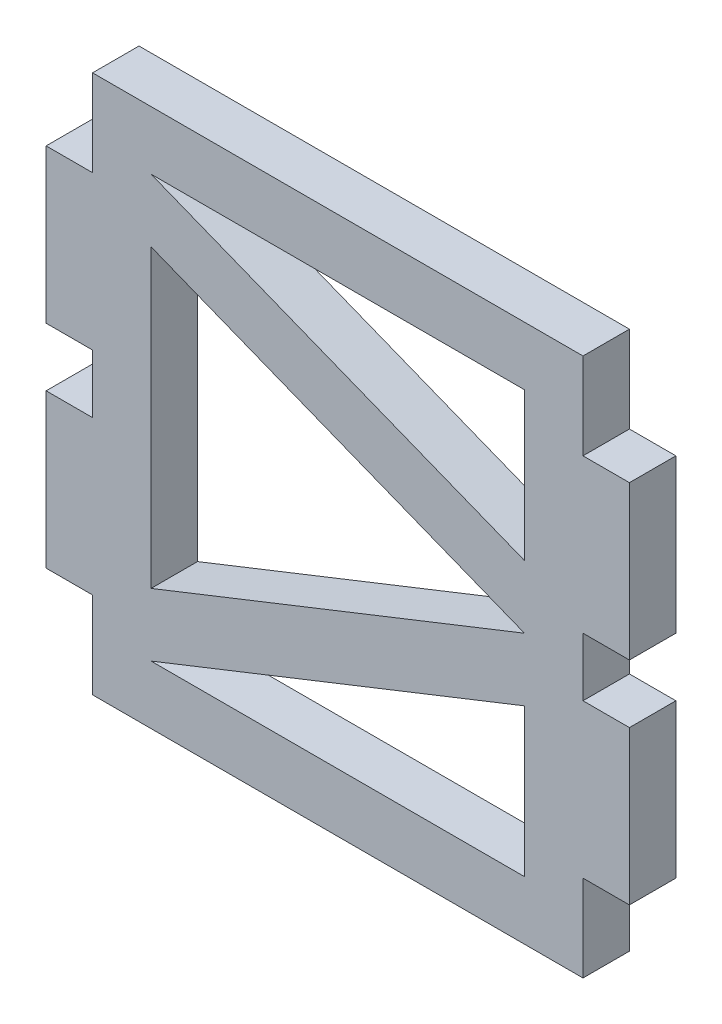
ISO-10303-21;
HEADER;
FILE_DESCRIPTION(('STEP AP214'),'2;1');
FILE_NAME('part.step','',(''),(''),'','','');
FILE_SCHEMA(('AUTOMOTIVE_DESIGN { 1 0 10303 214 1 1 1 1 }'));
ENDSEC;
DATA;
#1=APPLICATION_CONTEXT('core data for automotive mechanical design processes');
#2=APPLICATION_PROTOCOL_DEFINITION('international standard','automotive_design',2000,#1);
#3=PRODUCT_CONTEXT('',#1,'mechanical');
#4=PRODUCT('Part','Part','',(#3));
#5=PRODUCT_RELATED_PRODUCT_CATEGORY('part','',(#4));
#6=PRODUCT_DEFINITION_FORMATION('','',#4);
#7=PRODUCT_DEFINITION_CONTEXT('part definition',#1,'design');
#8=PRODUCT_DEFINITION('design','',#6,#7);
#9=PRODUCT_DEFINITION_SHAPE('','',#8);
#10=(LENGTH_UNIT() NAMED_UNIT(*) SI_UNIT(.MILLI.,.METRE.));
#11=(NAMED_UNIT(*) PLANE_ANGLE_UNIT() SI_UNIT($,.RADIAN.));
#12=(NAMED_UNIT(*) SI_UNIT($,.STERADIAN.) SOLID_ANGLE_UNIT());
#13=UNCERTAINTY_MEASURE_WITH_UNIT(LENGTH_MEASURE(1.E-05),#10,'distance_accuracy_value','');
#14=(GEOMETRIC_REPRESENTATION_CONTEXT(3) GLOBAL_UNCERTAINTY_ASSIGNED_CONTEXT((#13)) GLOBAL_UNIT_ASSIGNED_CONTEXT((#10,
#11,#12)) REPRESENTATION_CONTEXT('',''));
#15=CARTESIAN_POINT('',(0.,0.,0.));
#16=DIRECTION('',(0.,0.,1.));
#17=DIRECTION('',(1.,0.,0.));
#18=AXIS2_PLACEMENT_3D('',#15,#16,#17);
#19=CARTESIAN_POINT('',(7.175,50.1101546560199,57.452953627601));
#20=DIRECTION('',(1.,0.,0.));
#21=DIRECTION('',(0.,1.,0.));
#22=AXIS2_PLACEMENT_3D('',#19,#20,#21);
#23=PLANE('',#22);
#24=DIRECTION('',(0.,0.,-1.));
#25=VECTOR('',#24,1.);
#26=CARTESIAN_POINT('',(7.175,50.1101546560199,57.452953627601));
#27=LINE('',#26,#25);
#28=CARTESIAN_POINT('',(7.175,50.1101546560199,3.175));
#29=VERTEX_POINT('',#28);
#30=CARTESIAN_POINT('',(7.175,50.1101546560199,0.));
#31=VERTEX_POINT('',#30);
#32=EDGE_CURVE('E277',#29,#31,#27,.T.);
#33=ORIENTED_EDGE('',*,*,#32,.F.);
#34=DIRECTION('',(0.,-1.,0.));
#35=VECTOR('',#34,1.);
#36=CARTESIAN_POINT('',(7.175,50.1101546560199,3.175));
#37=LINE('',#36,#35);
#38=CARTESIAN_POINT('',(7.175,29.8898453439801,3.175));
#39=VERTEX_POINT('',#38);
#40=EDGE_CURVE('E515',#29,#39,#37,.T.);
#41=ORIENTED_EDGE('',*,*,#40,.T.);
#42=DIRECTION('',(0.,0.,-1.));
#43=VECTOR('',#42,1.);
#44=CARTESIAN_POINT('',(7.175,29.8898453439801,57.452953627601));
#45=LINE('',#44,#43);
#46=CARTESIAN_POINT('',(7.175,29.8898453439801,0.));
#47=VERTEX_POINT('',#46);
#48=EDGE_CURVE('E275',#39,#47,#45,.T.);
#49=ORIENTED_EDGE('',*,*,#48,.T.);
#50=DIRECTION('',(0.,-1.,0.));
#51=VECTOR('',#50,1.);
#52=CARTESIAN_POINT('',(7.175,50.1101546560199,0.));
#53=LINE('',#52,#51);
#54=EDGE_CURVE('E272',#31,#47,#53,.T.);
#55=ORIENTED_EDGE('',*,*,#54,.F.);
#56=EDGE_LOOP('',(#33,#41,#49,#55));
#57=FACE_BOUND('',#56,.T.);
#58=ADVANCED_FACE('F35',(#57),#23,.T.);
#59=CARTESIAN_POINT('',(32.7,40.,57.452953627601));
#60=DIRECTION('',(-0.368253405634251,-0.92972545906777,0.));
#61=DIRECTION('',(0.92972545906777,-0.368253405634251,0.));
#62=AXIS2_PLACEMENT_3D('',#59,#60,#61);
#63=PLANE('',#62);
#64=DIRECTION('',(0.,0.,-1.));
#65=VECTOR('',#64,1.);
#66=CARTESIAN_POINT('',(32.7,40.,57.452953627601));
#67=LINE('',#66,#65);
#68=CARTESIAN_POINT('',(32.7,40.,3.175));
#69=VERTEX_POINT('',#68);
#70=CARTESIAN_POINT('',(32.7,40.,0.));
#71=VERTEX_POINT('',#70);
#72=EDGE_CURVE('E279',#69,#71,#67,.T.);
#73=ORIENTED_EDGE('',*,*,#72,.F.);
#74=DIRECTION('',(-0.92972545906777,0.368253405634251,0.));
#75=VECTOR('',#74,1.);
#76=CARTESIAN_POINT('',(32.7,40.,3.175));
#77=LINE('',#76,#75);
#78=EDGE_CURVE('E518',#69,#29,#77,.T.);
#79=ORIENTED_EDGE('',*,*,#78,.T.);
#80=ORIENTED_EDGE('',*,*,#32,.T.);
#81=DIRECTION('',(-0.92972545906777,0.368253405634251,0.));
#82=VECTOR('',#81,1.);
#83=CARTESIAN_POINT('',(32.7,40.,0.));
#84=LINE('',#83,#82);
#85=EDGE_CURVE('E269',#71,#31,#84,.T.);
#86=ORIENTED_EDGE('',*,*,#85,.F.);
#87=EDGE_LOOP('',(#73,#79,#80,#86));
#88=FACE_BOUND('',#87,.T.);
#89=ADVANCED_FACE('F552',(#88),#63,.T.);
#90=CARTESIAN_POINT('',(7.175,29.8898453439801,57.452953627601));
#91=DIRECTION('',(-0.368253405634251,0.92972545906777,0.));
#92=DIRECTION('',(-0.92972545906777,-0.368253405634251,0.));
#93=AXIS2_PLACEMENT_3D('',#90,#91,#92);
#94=PLANE('',#93);
#95=ORIENTED_EDGE('',*,*,#48,.F.);
#96=DIRECTION('',(0.92972545906777,0.368253405634251,0.));
#97=VECTOR('',#96,1.);
#98=CARTESIAN_POINT('',(7.175,29.8898453439801,3.175));
#99=LINE('',#98,#97);
#100=EDGE_CURVE('E58',#39,#69,#99,.T.);
#101=ORIENTED_EDGE('',*,*,#100,.T.);
#102=ORIENTED_EDGE('',*,*,#72,.T.);
#103=DIRECTION('',(0.92972545906777,0.368253405634251,0.));
#104=VECTOR('',#103,1.);
#105=CARTESIAN_POINT('',(7.175,29.8898453439801,0.));
#106=LINE('',#105,#104);
#107=EDGE_CURVE('E266',#47,#71,#106,.T.);
#108=ORIENTED_EDGE('',*,*,#107,.F.);
#109=EDGE_LOOP('',(#95,#101,#102,#108));
#110=FACE_BOUND('',#109,.T.);
#111=ADVANCED_FACE('F544',(#110),#94,.T.);
#112=CARTESIAN_POINT('',(3.175,27.5,57.452953627601));
#113=DIRECTION('',(0.,1.,0.));
#114=DIRECTION('',(0.,0.,1.));
#115=AXIS2_PLACEMENT_3D('',#112,#113,#114);
#116=PLANE('',#115);
#117=DIRECTION('',(1.,0.,0.));
#118=VECTOR('',#117,1.);
#119=CARTESIAN_POINT('',(3.175,27.5,3.175));
#120=LINE('',#119,#118);
#121=CARTESIAN_POINT('',(0.,27.5,3.175));
#122=VERTEX_POINT('',#121);
#123=CARTESIAN_POINT('',(3.175,27.5,3.175));
#124=VERTEX_POINT('',#123);
#125=EDGE_CURVE('E522',#122,#124,#120,.T.);
#126=ORIENTED_EDGE('',*,*,#125,.F.);
#127=DIRECTION('',(0.,0.,-1.));
#128=VECTOR('',#127,1.);
#129=CARTESIAN_POINT('',(0.,27.5,57.452953627601));
#130=LINE('',#129,#128);
#131=CARTESIAN_POINT('',(0.,27.5,0.));
#132=VERTEX_POINT('',#131);
#133=EDGE_CURVE('E50',#122,#132,#130,.T.);
#134=ORIENTED_EDGE('',*,*,#133,.T.);
#135=DIRECTION('',(1.,0.,0.));
#136=VECTOR('',#135,1.);
#137=CARTESIAN_POINT('',(3.175,27.5,0.));
#138=LINE('',#137,#136);
#139=CARTESIAN_POINT('',(3.175,27.5,0.));
#140=VERTEX_POINT('',#139);
#141=EDGE_CURVE('E337',#132,#140,#138,.T.);
#142=ORIENTED_EDGE('',*,*,#141,.T.);
#143=DIRECTION('',(0.,0.,-1.));
#144=VECTOR('',#143,1.);
#145=CARTESIAN_POINT('',(3.175,27.5,57.452953627601));
#146=LINE('',#145,#144);
#147=EDGE_CURVE('E340',#124,#140,#146,.T.);
#148=ORIENTED_EDGE('',*,*,#147,.F.);
#149=EDGE_LOOP('',(#126,#134,#142,#148));
#150=FACE_BOUND('',#149,.T.);
#151=ADVANCED_FACE('F396',(#150),#116,.F.);
#152=CARTESIAN_POINT('',(0.,27.5,57.452953627601));
#153=DIRECTION('',(1.,0.,0.));
#154=DIRECTION('',(0.,0.,-1.));
#155=AXIS2_PLACEMENT_3D('',#152,#153,#154);
#156=PLANE('',#155);
#157=DIRECTION('',(0.,-1.,0.));
#158=VECTOR('',#157,1.);
#159=CARTESIAN_POINT('',(0.,27.5,3.175));
#160=LINE('',#159,#158);
#161=CARTESIAN_POINT('',(0.,38.,3.175));
#162=VERTEX_POINT('',#161);
#163=EDGE_CURVE('E403',#162,#122,#160,.T.);
#164=ORIENTED_EDGE('',*,*,#163,.F.);
#165=DIRECTION('',(0.,0.,-1.));
#166=VECTOR('',#165,1.);
#167=CARTESIAN_POINT('',(0.,38.,57.452953627601));
#168=LINE('',#167,#166);
#169=CARTESIAN_POINT('',(0.,38.,0.));
#170=VERTEX_POINT('',#169);
#171=EDGE_CURVE('E343',#162,#170,#168,.T.);
#172=ORIENTED_EDGE('',*,*,#171,.T.);
#173=DIRECTION('',(0.,-1.,0.));
#174=VECTOR('',#173,1.);
#175=CARTESIAN_POINT('',(0.,27.5,0.));
#176=LINE('',#175,#174);
#177=EDGE_CURVE('E335',#170,#132,#176,.T.);
#178=ORIENTED_EDGE('',*,*,#177,.T.);
#179=ORIENTED_EDGE('',*,*,#133,.F.);
#180=EDGE_LOOP('',(#164,#172,#178,#179));
#181=FACE_BOUND('',#180,.T.);
#182=ADVANCED_FACE('F400',(#181),#156,.F.);
#183=CARTESIAN_POINT('',(3.175,38.,57.452953627601));
#184=DIRECTION('',(0.,-1.,0.));
#185=DIRECTION('',(0.,0.,-1.));
#186=AXIS2_PLACEMENT_3D('',#183,#184,#185);
#187=PLANE('',#186);
#188=DIRECTION('',(-1.,0.,0.));
#189=VECTOR('',#188,1.);
#190=CARTESIAN_POINT('',(3.175,38.,3.175));
#191=LINE('',#190,#189);
#192=CARTESIAN_POINT('',(3.175,38.,3.175));
#193=VERTEX_POINT('',#192);
#194=EDGE_CURVE('E408',#193,#162,#191,.T.);
#195=ORIENTED_EDGE('',*,*,#194,.F.);
#196=DIRECTION('',(0.,0.,-1.));
#197=VECTOR('',#196,1.);
#198=CARTESIAN_POINT('',(3.175,38.,57.452953627601));
#199=LINE('',#198,#197);
#200=CARTESIAN_POINT('',(3.175,38.,0.));
#201=VERTEX_POINT('',#200);
#202=EDGE_CURVE('E345',#193,#201,#199,.T.);
#203=ORIENTED_EDGE('',*,*,#202,.T.);
#204=DIRECTION('',(-1.,0.,0.));
#205=VECTOR('',#204,1.);
#206=CARTESIAN_POINT('',(3.175,38.,0.));
#207=LINE('',#206,#205);
#208=EDGE_CURVE('E332',#201,#170,#207,.T.);
#209=ORIENTED_EDGE('',*,*,#208,.T.);
#210=ORIENTED_EDGE('',*,*,#171,.F.);
#211=EDGE_LOOP('',(#195,#203,#209,#210));
#212=FACE_BOUND('',#211,.T.);
#213=ADVANCED_FACE('F406',(#212),#187,.F.);
#214=CARTESIAN_POINT('',(3.175,42.,57.452953627601));
#215=DIRECTION('',(1.,0.,0.));
#216=DIRECTION('',(0.,0.,-1.));
#217=AXIS2_PLACEMENT_3D('',#214,#215,#216);
#218=PLANE('',#217);
#219=DIRECTION('',(0.,-1.,0.));
#220=VECTOR('',#219,1.);
#221=CARTESIAN_POINT('',(3.175,42.,3.175));
#222=LINE('',#221,#220);
#223=CARTESIAN_POINT('',(3.175,42.,3.175));
#224=VERTEX_POINT('',#223);
#225=EDGE_CURVE('E526',#224,#193,#222,.T.);
#226=ORIENTED_EDGE('',*,*,#225,.F.);
#227=DIRECTION('',(0.,0.,-1.));
#228=VECTOR('',#227,1.);
#229=CARTESIAN_POINT('',(3.175,42.,57.452953627601));
#230=LINE('',#229,#228);
#231=CARTESIAN_POINT('',(3.175,42.,0.));
#232=VERTEX_POINT('',#231);
#233=EDGE_CURVE('E347',#224,#232,#230,.T.);
#234=ORIENTED_EDGE('',*,*,#233,.T.);
#235=DIRECTION('',(0.,-1.,0.));
#236=VECTOR('',#235,1.);
#237=CARTESIAN_POINT('',(3.175,42.,0.));
#238=LINE('',#237,#236);
#239=EDGE_CURVE('E329',#232,#201,#238,.T.);
#240=ORIENTED_EDGE('',*,*,#239,.T.);
#241=ORIENTED_EDGE('',*,*,#202,.F.);
#242=EDGE_LOOP('',(#226,#234,#240,#241));
#243=FACE_BOUND('',#242,.T.);
#244=ADVANCED_FACE('F411',(#243),#218,.F.);
#245=CARTESIAN_POINT('',(3.175,42.,57.452953627601));
#246=DIRECTION('',(0.,1.,0.));
#247=DIRECTION('',(0.,0.,1.));
#248=AXIS2_PLACEMENT_3D('',#245,#246,#247);
#249=PLANE('',#248);
#250=DIRECTION('',(1.,0.,0.));
#251=VECTOR('',#250,1.);
#252=CARTESIAN_POINT('',(3.175,42.,3.175));
#253=LINE('',#252,#251);
#254=CARTESIAN_POINT('',(0.,42.,3.175));
#255=VERTEX_POINT('',#254);
#256=EDGE_CURVE('E420',#255,#224,#253,.T.);
#257=ORIENTED_EDGE('',*,*,#256,.F.);
#258=DIRECTION('',(0.,0.,-1.));
#259=VECTOR('',#258,1.);
#260=CARTESIAN_POINT('',(0.,42.,57.452953627601));
#261=LINE('',#260,#259);
#262=CARTESIAN_POINT('',(0.,42.,0.));
#263=VERTEX_POINT('',#262);
#264=EDGE_CURVE('E349',#255,#263,#261,.T.);
#265=ORIENTED_EDGE('',*,*,#264,.T.);
#266=DIRECTION('',(1.,0.,0.));
#267=VECTOR('',#266,1.);
#268=CARTESIAN_POINT('',(3.175,42.,0.));
#269=LINE('',#268,#267);
#270=EDGE_CURVE('E326',#263,#232,#269,.T.);
#271=ORIENTED_EDGE('',*,*,#270,.T.);
#272=ORIENTED_EDGE('',*,*,#233,.F.);
#273=EDGE_LOOP('',(#257,#265,#271,#272));
#274=FACE_BOUND('',#273,.T.);
#275=ADVANCED_FACE('F417',(#274),#249,.F.);
#276=CARTESIAN_POINT('',(0.,42.,57.452953627601));
#277=DIRECTION('',(1.,0.,0.));
#278=DIRECTION('',(0.,0.,-1.));
#279=AXIS2_PLACEMENT_3D('',#276,#277,#278);
#280=PLANE('',#279);
#281=DIRECTION('',(0.,-1.,0.));
#282=VECTOR('',#281,1.);
#283=CARTESIAN_POINT('',(0.,42.,3.175));
#284=LINE('',#283,#282);
#285=CARTESIAN_POINT('',(0.,52.5000000000001,3.175));
#286=VERTEX_POINT('',#285);
#287=EDGE_CURVE('E425',#286,#255,#284,.T.);
#288=ORIENTED_EDGE('',*,*,#287,.F.);
#289=DIRECTION('',(0.,0.,-1.));
#290=VECTOR('',#289,1.);
#291=CARTESIAN_POINT('',(0.,52.5000000000001,57.452953627601));
#292=LINE('',#291,#290);
#293=CARTESIAN_POINT('',(0.,52.5000000000001,0.));
#294=VERTEX_POINT('',#293);
#295=EDGE_CURVE('E351',#286,#294,#292,.T.);
#296=ORIENTED_EDGE('',*,*,#295,.T.);
#297=DIRECTION('',(0.,-1.,0.));
#298=VECTOR('',#297,1.);
#299=CARTESIAN_POINT('',(0.,42.,0.));
#300=LINE('',#299,#298);
#301=EDGE_CURVE('E323',#294,#263,#300,.T.);
#302=ORIENTED_EDGE('',*,*,#301,.T.);
#303=ORIENTED_EDGE('',*,*,#264,.F.);
#304=EDGE_LOOP('',(#288,#296,#302,#303));
#305=FACE_BOUND('',#304,.T.);
#306=ADVANCED_FACE('F423',(#305),#280,.F.);
#307=CARTESIAN_POINT('',(3.175,52.5000000000001,57.452953627601));
#308=DIRECTION('',(0.,-1.,0.));
#309=DIRECTION('',(0.,0.,-1.));
#310=AXIS2_PLACEMENT_3D('',#307,#308,#309);
#311=PLANE('',#310);
#312=DIRECTION('',(-1.,0.,0.));
#313=VECTOR('',#312,1.);
#314=CARTESIAN_POINT('',(3.175,52.5000000000001,3.175));
#315=LINE('',#314,#313);
#316=CARTESIAN_POINT('',(3.175,52.5000000000001,3.175));
#317=VERTEX_POINT('',#316);
#318=EDGE_CURVE('E530',#317,#286,#315,.T.);
#319=ORIENTED_EDGE('',*,*,#318,.F.);
#320=DIRECTION('',(0.,0.,-1.));
#321=VECTOR('',#320,1.);
#322=CARTESIAN_POINT('',(3.175,52.5000000000001,57.452953627601));
#323=LINE('',#322,#321);
#324=CARTESIAN_POINT('',(3.175,52.5000000000001,0.));
#325=VERTEX_POINT('',#324);
#326=EDGE_CURVE('E353',#317,#325,#323,.T.);
#327=ORIENTED_EDGE('',*,*,#326,.T.);
#328=DIRECTION('',(-1.,0.,0.));
#329=VECTOR('',#328,1.);
#330=CARTESIAN_POINT('',(3.175,52.5000000000001,0.));
#331=LINE('',#330,#329);
#332=EDGE_CURVE('E320',#325,#294,#331,.T.);
#333=ORIENTED_EDGE('',*,*,#332,.T.);
#334=ORIENTED_EDGE('',*,*,#295,.F.);
#335=EDGE_LOOP('',(#319,#327,#333,#334));
#336=FACE_BOUND('',#335,.T.);
#337=ADVANCED_FACE('F428',(#336),#311,.F.);
#338=CARTESIAN_POINT('',(3.175,58.4125,57.452953627601));
#339=DIRECTION('',(1.,0.,0.));
#340=DIRECTION('',(0.,0.,-1.));
#341=AXIS2_PLACEMENT_3D('',#338,#339,#340);
#342=PLANE('',#341);
#343=DIRECTION('',(0.,-1.,0.));
#344=VECTOR('',#343,1.);
#345=CARTESIAN_POINT('',(3.175,58.4125,3.175));
#346=LINE('',#345,#344);
#347=CARTESIAN_POINT('',(3.175,58.4125,3.175));
#348=VERTEX_POINT('',#347);
#349=EDGE_CURVE('E437',#348,#317,#346,.T.);
#350=ORIENTED_EDGE('',*,*,#349,.F.);
#351=DIRECTION('',(0.,0.,-1.));
#352=VECTOR('',#351,1.);
#353=CARTESIAN_POINT('',(3.175,58.4125,57.452953627601));
#354=LINE('',#353,#352);
#355=CARTESIAN_POINT('',(3.175,58.4125,0.));
#356=VERTEX_POINT('',#355);
#357=EDGE_CURVE('E355',#348,#356,#354,.T.);
#358=ORIENTED_EDGE('',*,*,#357,.T.);
#359=DIRECTION('',(0.,-1.,0.));
#360=VECTOR('',#359,1.);
#361=CARTESIAN_POINT('',(3.175,58.4125,0.));
#362=LINE('',#361,#360);
#363=EDGE_CURVE('E317',#356,#325,#362,.T.);
#364=ORIENTED_EDGE('',*,*,#363,.T.);
#365=ORIENTED_EDGE('',*,*,#326,.F.);
#366=EDGE_LOOP('',(#350,#358,#364,#365));
#367=FACE_BOUND('',#366,.T.);
#368=ADVANCED_FACE('F434',(#367),#342,.F.);
#369=CARTESIAN_POINT('',(36.7,58.4125,57.452953627601));
#370=DIRECTION('',(0.,-1.,0.));
#371=DIRECTION('',(0.,0.,-1.));
#372=AXIS2_PLACEMENT_3D('',#369,#370,#371);
#373=PLANE('',#372);
#374=DIRECTION('',(-1.,0.,0.));
#375=VECTOR('',#374,1.);
#376=CARTESIAN_POINT('',(36.7,58.4125,3.175));
#377=LINE('',#376,#375);
#378=CARTESIAN_POINT('',(36.7,58.4125,3.175));
#379=VERTEX_POINT('',#378);
#380=EDGE_CURVE('E442',#379,#348,#377,.T.);
#381=ORIENTED_EDGE('',*,*,#380,.F.);
#382=DIRECTION('',(0.,0.,-1.));
#383=VECTOR('',#382,1.);
#384=CARTESIAN_POINT('',(36.7,58.4125,57.452953627601));
#385=LINE('',#384,#383);
#386=CARTESIAN_POINT('',(36.7,58.4125,0.));
#387=VERTEX_POINT('',#386);
#388=EDGE_CURVE('E357',#379,#387,#385,.T.);
#389=ORIENTED_EDGE('',*,*,#388,.T.);
#390=DIRECTION('',(-1.,0.,0.));
#391=VECTOR('',#390,1.);
#392=CARTESIAN_POINT('',(36.7,58.4125,0.));
#393=LINE('',#392,#391);
#394=EDGE_CURVE('E314',#387,#356,#393,.T.);
#395=ORIENTED_EDGE('',*,*,#394,.T.);
#396=ORIENTED_EDGE('',*,*,#357,.F.);
#397=EDGE_LOOP('',(#381,#389,#395,#396));
#398=FACE_BOUND('',#397,.T.);
#399=ADVANCED_FACE('F440',(#398),#373,.F.);
#400=CARTESIAN_POINT('',(36.7,52.5,57.452953627601));
#401=DIRECTION('',(-1.,0.,0.));
#402=DIRECTION('',(0.,0.,1.));
#403=AXIS2_PLACEMENT_3D('',#400,#401,#402);
#404=PLANE('',#403);
#405=DIRECTION('',(0.,1.,0.));
#406=VECTOR('',#405,1.);
#407=CARTESIAN_POINT('',(36.7,52.5,3.175));
#408=LINE('',#407,#406);
#409=CARTESIAN_POINT('',(36.7,52.5,3.175));
#410=VERTEX_POINT('',#409);
#411=EDGE_CURVE('E534',#410,#379,#408,.T.);
#412=ORIENTED_EDGE('',*,*,#411,.F.);
#413=DIRECTION('',(0.,0.,-1.));
#414=VECTOR('',#413,1.);
#415=CARTESIAN_POINT('',(36.7,52.5,57.452953627601));
#416=LINE('',#415,#414);
#417=CARTESIAN_POINT('',(36.7,52.5,0.));
#418=VERTEX_POINT('',#417);
#419=EDGE_CURVE('E359',#410,#418,#416,.T.);
#420=ORIENTED_EDGE('',*,*,#419,.T.);
#421=DIRECTION('',(0.,1.,0.));
#422=VECTOR('',#421,1.);
#423=CARTESIAN_POINT('',(36.7,52.5,0.));
#424=LINE('',#423,#422);
#425=EDGE_CURVE('E311',#418,#387,#424,.T.);
#426=ORIENTED_EDGE('',*,*,#425,.T.);
#427=ORIENTED_EDGE('',*,*,#388,.F.);
#428=EDGE_LOOP('',(#412,#420,#426,#427));
#429=FACE_BOUND('',#428,.T.);
#430=ADVANCED_FACE('F445',(#429),#404,.F.);
#431=CARTESIAN_POINT('',(36.7,52.5,57.452953627601));
#432=DIRECTION('',(0.,-1.,0.));
#433=DIRECTION('',(1.,0.,0.));
#434=AXIS2_PLACEMENT_3D('',#431,#432,#433);
#435=PLANE('',#434);
#436=DIRECTION('',(-1.,0.,0.));
#437=VECTOR('',#436,1.);
#438=CARTESIAN_POINT('',(36.7,52.5,3.175));
#439=LINE('',#438,#437);
#440=CARTESIAN_POINT('',(39.875,52.5000000000001,3.175));
#441=VERTEX_POINT('',#440);
#442=EDGE_CURVE('E454',#441,#410,#439,.T.);
#443=ORIENTED_EDGE('',*,*,#442,.F.);
#444=DIRECTION('',(0.,0.,-1.));
#445=VECTOR('',#444,1.);
#446=CARTESIAN_POINT('',(39.875,52.5000000000001,57.452953627601));
#447=LINE('',#446,#445);
#448=CARTESIAN_POINT('',(39.875,52.5000000000001,0.));
#449=VERTEX_POINT('',#448);
#450=EDGE_CURVE('E361',#441,#449,#447,.T.);
#451=ORIENTED_EDGE('',*,*,#450,.T.);
#452=DIRECTION('',(-1.,0.,0.));
#453=VECTOR('',#452,1.);
#454=CARTESIAN_POINT('',(36.7,52.5,0.));
#455=LINE('',#454,#453);
#456=EDGE_CURVE('E308',#449,#418,#455,.T.);
#457=ORIENTED_EDGE('',*,*,#456,.T.);
#458=ORIENTED_EDGE('',*,*,#419,.F.);
#459=EDGE_LOOP('',(#443,#451,#457,#458));
#460=FACE_BOUND('',#459,.T.);
#461=ADVANCED_FACE('F451',(#460),#435,.F.);
#462=CARTESIAN_POINT('',(39.875,42.,57.452953627601));
#463=DIRECTION('',(-1.,0.,0.));
#464=DIRECTION('',(0.,-1.,0.));
#465=AXIS2_PLACEMENT_3D('',#462,#463,#464);
#466=PLANE('',#465);
#467=DIRECTION('',(0.,1.,0.));
#468=VECTOR('',#467,1.);
#469=CARTESIAN_POINT('',(39.875,42.,3.175));
#470=LINE('',#469,#468);
#471=CARTESIAN_POINT('',(39.875,42.,3.175));
#472=VERTEX_POINT('',#471);
#473=EDGE_CURVE('E459',#472,#441,#470,.T.);
#474=ORIENTED_EDGE('',*,*,#473,.F.);
#475=DIRECTION('',(0.,0.,-1.));
#476=VECTOR('',#475,1.);
#477=CARTESIAN_POINT('',(39.875,42.,57.452953627601));
#478=LINE('',#477,#476);
#479=CARTESIAN_POINT('',(39.875,42.,0.));
#480=VERTEX_POINT('',#479);
#481=EDGE_CURVE('E363',#472,#480,#478,.T.);
#482=ORIENTED_EDGE('',*,*,#481,.T.);
#483=DIRECTION('',(0.,1.,0.));
#484=VECTOR('',#483,1.);
#485=CARTESIAN_POINT('',(39.875,42.,0.));
#486=LINE('',#485,#484);
#487=EDGE_CURVE('E305',#480,#449,#486,.T.);
#488=ORIENTED_EDGE('',*,*,#487,.T.);
#489=ORIENTED_EDGE('',*,*,#450,.F.);
#490=EDGE_LOOP('',(#474,#482,#488,#489));
#491=FACE_BOUND('',#490,.T.);
#492=ADVANCED_FACE('F457',(#491),#466,.F.);
#493=CARTESIAN_POINT('',(36.7,42.,57.452953627601));
#494=DIRECTION('',(0.,1.,0.));
#495=DIRECTION('',(0.,0.,1.));
#496=AXIS2_PLACEMENT_3D('',#493,#494,#495);
#497=PLANE('',#496);
#498=DIRECTION('',(1.,0.,0.));
#499=VECTOR('',#498,1.);
#500=CARTESIAN_POINT('',(36.7,42.,3.175));
#501=LINE('',#500,#499);
#502=CARTESIAN_POINT('',(36.7,42.,3.175));
#503=VERTEX_POINT('',#502);
#504=EDGE_CURVE('E538',#503,#472,#501,.T.);
#505=ORIENTED_EDGE('',*,*,#504,.F.);
#506=DIRECTION('',(0.,0.,-1.));
#507=VECTOR('',#506,1.);
#508=CARTESIAN_POINT('',(36.7,42.,57.452953627601));
#509=LINE('',#508,#507);
#510=CARTESIAN_POINT('',(36.7,42.,0.));
#511=VERTEX_POINT('',#510);
#512=EDGE_CURVE('E365',#503,#511,#509,.T.);
#513=ORIENTED_EDGE('',*,*,#512,.T.);
#514=DIRECTION('',(1.,0.,0.));
#515=VECTOR('',#514,1.);
#516=CARTESIAN_POINT('',(36.7,42.,0.));
#517=LINE('',#516,#515);
#518=EDGE_CURVE('E302',#511,#480,#517,.T.);
#519=ORIENTED_EDGE('',*,*,#518,.T.);
#520=ORIENTED_EDGE('',*,*,#481,.F.);
#521=EDGE_LOOP('',(#505,#513,#519,#520));
#522=FACE_BOUND('',#521,.T.);
#523=ADVANCED_FACE('F462',(#522),#497,.F.);
#524=CARTESIAN_POINT('',(36.7,42.,57.452953627601));
#525=DIRECTION('',(-1.,0.,0.));
#526=DIRECTION('',(0.,-1.,0.));
#527=AXIS2_PLACEMENT_3D('',#524,#525,#526);
#528=PLANE('',#527);
#529=DIRECTION('',(0.,1.,0.));
#530=VECTOR('',#529,1.);
#531=CARTESIAN_POINT('',(36.7,42.,3.175));
#532=LINE('',#531,#530);
#533=CARTESIAN_POINT('',(36.7,38.,3.175));
#534=VERTEX_POINT('',#533);
#535=EDGE_CURVE('E471',#534,#503,#532,.T.);
#536=ORIENTED_EDGE('',*,*,#535,.F.);
#537=DIRECTION('',(0.,0.,-1.));
#538=VECTOR('',#537,1.);
#539=CARTESIAN_POINT('',(36.7,38.,57.452953627601));
#540=LINE('',#539,#538);
#541=CARTESIAN_POINT('',(36.7,38.,0.));
#542=VERTEX_POINT('',#541);
#543=EDGE_CURVE('E367',#534,#542,#540,.T.);
#544=ORIENTED_EDGE('',*,*,#543,.T.);
#545=DIRECTION('',(0.,1.,0.));
#546=VECTOR('',#545,1.);
#547=CARTESIAN_POINT('',(36.7,42.,0.));
#548=LINE('',#547,#546);
#549=EDGE_CURVE('E299',#542,#511,#548,.T.);
#550=ORIENTED_EDGE('',*,*,#549,.T.);
#551=ORIENTED_EDGE('',*,*,#512,.F.);
#552=EDGE_LOOP('',(#536,#544,#550,#551));
#553=FACE_BOUND('',#552,.T.);
#554=ADVANCED_FACE('F468',(#553),#528,.F.);
#555=CARTESIAN_POINT('',(36.7,38.,57.452953627601));
#556=DIRECTION('',(0.,-1.,0.));
#557=DIRECTION('',(1.,0.,0.));
#558=AXIS2_PLACEMENT_3D('',#555,#556,#557);
#559=PLANE('',#558);
#560=DIRECTION('',(-1.,0.,0.));
#561=VECTOR('',#560,1.);
#562=CARTESIAN_POINT('',(36.7,38.,3.175));
#563=LINE('',#562,#561);
#564=CARTESIAN_POINT('',(39.875,38.,3.175));
#565=VERTEX_POINT('',#564);
#566=EDGE_CURVE('E476',#565,#534,#563,.T.);
#567=ORIENTED_EDGE('',*,*,#566,.F.);
#568=DIRECTION('',(0.,0.,-1.));
#569=VECTOR('',#568,1.);
#570=CARTESIAN_POINT('',(39.875,38.,57.452953627601));
#571=LINE('',#570,#569);
#572=CARTESIAN_POINT('',(39.875,38.,0.));
#573=VERTEX_POINT('',#572);
#574=EDGE_CURVE('E369',#565,#573,#571,.T.);
#575=ORIENTED_EDGE('',*,*,#574,.T.);
#576=DIRECTION('',(-1.,0.,0.));
#577=VECTOR('',#576,1.);
#578=CARTESIAN_POINT('',(36.7,38.,0.));
#579=LINE('',#578,#577);
#580=EDGE_CURVE('E296',#573,#542,#579,.T.);
#581=ORIENTED_EDGE('',*,*,#580,.T.);
#582=ORIENTED_EDGE('',*,*,#543,.F.);
#583=EDGE_LOOP('',(#567,#575,#581,#582));
#584=FACE_BOUND('',#583,.T.);
#585=ADVANCED_FACE('F474',(#584),#559,.F.);
#586=CARTESIAN_POINT('',(39.875,27.5,57.452953627601));
#587=DIRECTION('',(-1.,0.,0.));
#588=DIRECTION('',(0.,-1.,0.));
#589=AXIS2_PLACEMENT_3D('',#586,#587,#588);
#590=PLANE('',#589);
#591=DIRECTION('',(0.,1.,0.));
#592=VECTOR('',#591,1.);
#593=CARTESIAN_POINT('',(39.875,27.5,3.175));
#594=LINE('',#593,#592);
#595=CARTESIAN_POINT('',(39.875,27.5,3.175));
#596=VERTEX_POINT('',#595);
#597=EDGE_CURVE('E542',#596,#565,#594,.T.);
#598=ORIENTED_EDGE('',*,*,#597,.F.);
#599=DIRECTION('',(0.,0.,-1.));
#600=VECTOR('',#599,1.);
#601=CARTESIAN_POINT('',(39.875,27.5,57.452953627601));
#602=LINE('',#601,#600);
#603=CARTESIAN_POINT('',(39.875,27.5,0.));
#604=VERTEX_POINT('',#603);
#605=EDGE_CURVE('E371',#596,#604,#602,.T.);
#606=ORIENTED_EDGE('',*,*,#605,.T.);
#607=DIRECTION('',(0.,1.,0.));
#608=VECTOR('',#607,1.);
#609=CARTESIAN_POINT('',(39.875,27.5,0.));
#610=LINE('',#609,#608);
#611=EDGE_CURVE('E293',#604,#573,#610,.T.);
#612=ORIENTED_EDGE('',*,*,#611,.T.);
#613=ORIENTED_EDGE('',*,*,#574,.F.);
#614=EDGE_LOOP('',(#598,#606,#612,#613));
#615=FACE_BOUND('',#614,.T.);
#616=ADVANCED_FACE('F479',(#615),#590,.F.);
#617=CARTESIAN_POINT('',(36.7,27.5,57.452953627601));
#618=DIRECTION('',(0.,1.,0.));
#619=DIRECTION('',(0.,0.,1.));
#620=AXIS2_PLACEMENT_3D('',#617,#618,#619);
#621=PLANE('',#620);
#622=DIRECTION('',(1.,0.,0.));
#623=VECTOR('',#622,1.);
#624=CARTESIAN_POINT('',(36.7,27.5,3.175));
#625=LINE('',#624,#623);
#626=CARTESIAN_POINT('',(36.7,27.5,3.175));
#627=VERTEX_POINT('',#626);
#628=EDGE_CURVE('E485',#627,#596,#625,.T.);
#629=ORIENTED_EDGE('',*,*,#628,.F.);
#630=DIRECTION('',(0.,0.,-1.));
#631=VECTOR('',#630,1.);
#632=CARTESIAN_POINT('',(36.7,27.5,57.452953627601));
#633=LINE('',#632,#631);
#634=CARTESIAN_POINT('',(36.7,27.5,0.));
#635=VERTEX_POINT('',#634);
#636=EDGE_CURVE('E373',#627,#635,#633,.T.);
#637=ORIENTED_EDGE('',*,*,#636,.T.);
#638=DIRECTION('',(1.,0.,0.));
#639=VECTOR('',#638,1.);
#640=CARTESIAN_POINT('',(36.7,27.5,0.));
#641=LINE('',#640,#639);
#642=EDGE_CURVE('E290',#635,#604,#641,.T.);
#643=ORIENTED_EDGE('',*,*,#642,.T.);
#644=ORIENTED_EDGE('',*,*,#605,.F.);
#645=EDGE_LOOP('',(#629,#637,#643,#644));
#646=FACE_BOUND('',#645,.T.);
#647=ADVANCED_FACE('F482',(#646),#621,.F.);
#648=CARTESIAN_POINT('',(36.7,27.5,57.452953627601));
#649=DIRECTION('',(-1.,0.,0.));
#650=DIRECTION('',(0.,0.,1.));
#651=AXIS2_PLACEMENT_3D('',#648,#649,#650);
#652=PLANE('',#651);
#653=DIRECTION('',(0.,1.,0.));
#654=VECTOR('',#653,1.);
#655=CARTESIAN_POINT('',(36.7,27.5,3.175));
#656=LINE('',#655,#654);
#657=CARTESIAN_POINT('',(36.7,21.5875,3.175));
#658=VERTEX_POINT('',#657);
#659=EDGE_CURVE('E489',#658,#627,#656,.T.);
#660=ORIENTED_EDGE('',*,*,#659,.F.);
#661=DIRECTION('',(0.,0.,-1.));
#662=VECTOR('',#661,1.);
#663=CARTESIAN_POINT('',(36.7,21.5875,57.452953627601));
#664=LINE('',#663,#662);
#665=CARTESIAN_POINT('',(36.7,21.5875,0.));
#666=VERTEX_POINT('',#665);
#667=EDGE_CURVE('E375',#658,#666,#664,.T.);
#668=ORIENTED_EDGE('',*,*,#667,.T.);
#669=DIRECTION('',(0.,1.,0.));
#670=VECTOR('',#669,1.);
#671=CARTESIAN_POINT('',(36.7,27.5,0.));
#672=LINE('',#671,#670);
#673=EDGE_CURVE('E287',#666,#635,#672,.T.);
#674=ORIENTED_EDGE('',*,*,#673,.T.);
#675=ORIENTED_EDGE('',*,*,#636,.F.);
#676=EDGE_LOOP('',(#660,#668,#674,#675));
#677=FACE_BOUND('',#676,.T.);
#678=ADVANCED_FACE('F488',(#677),#652,.F.);
#679=CARTESIAN_POINT('',(36.7,21.5875,57.452953627601));
#680=DIRECTION('',(0.,1.,0.));
#681=DIRECTION('',(0.,0.,1.));
#682=AXIS2_PLACEMENT_3D('',#679,#680,#681);
#683=PLANE('',#682);
#684=DIRECTION('',(1.,0.,0.));
#685=VECTOR('',#684,1.);
#686=CARTESIAN_POINT('',(36.7,21.5875,3.175));
#687=LINE('',#686,#685);
#688=CARTESIAN_POINT('',(3.175,21.5875,3.175));
#689=VERTEX_POINT('',#688);
#690=EDGE_CURVE('E383',#689,#658,#687,.T.);
#691=ORIENTED_EDGE('',*,*,#690,.F.);
#692=DIRECTION('',(0.,0.,-1.));
#693=VECTOR('',#692,1.);
#694=CARTESIAN_POINT('',(3.175,21.5875,57.452953627601));
#695=LINE('',#694,#693);
#696=CARTESIAN_POINT('',(3.175,21.5875,0.));
#697=VERTEX_POINT('',#696);
#698=EDGE_CURVE('E43',#689,#697,#695,.T.);
#699=ORIENTED_EDGE('',*,*,#698,.T.);
#700=DIRECTION('',(1.,0.,0.));
#701=VECTOR('',#700,1.);
#702=CARTESIAN_POINT('',(36.7,21.5875,0.));
#703=LINE('',#702,#701);
#704=EDGE_CURVE('E284',#697,#666,#703,.T.);
#705=ORIENTED_EDGE('',*,*,#704,.T.);
#706=ORIENTED_EDGE('',*,*,#667,.F.);
#707=EDGE_LOOP('',(#691,#699,#705,#706));
#708=FACE_BOUND('',#707,.T.);
#709=ADVANCED_FACE('F379',(#708),#683,.F.);
#710=CARTESIAN_POINT('',(3.175,21.5875,57.452953627601));
#711=DIRECTION('',(1.,0.,0.));
#712=DIRECTION('',(0.,0.,-1.));
#713=AXIS2_PLACEMENT_3D('',#710,#711,#712);
#714=PLANE('',#713);
#715=DIRECTION('',(0.,-1.,0.));
#716=VECTOR('',#715,1.);
#717=CARTESIAN_POINT('',(3.175,21.5875,3.175));
#718=LINE('',#717,#716);
#719=EDGE_CURVE('E393',#124,#689,#718,.T.);
#720=ORIENTED_EDGE('',*,*,#719,.F.);
#721=ORIENTED_EDGE('',*,*,#147,.T.);
#722=DIRECTION('',(0.,-1.,0.));
#723=VECTOR('',#722,1.);
#724=CARTESIAN_POINT('',(3.175,21.5875,0.));
#725=LINE('',#724,#723);
#726=EDGE_CURVE('E281',#140,#697,#725,.T.);
#727=ORIENTED_EDGE('',*,*,#726,.T.);
#728=ORIENTED_EDGE('',*,*,#698,.F.);
#729=EDGE_LOOP('',(#720,#721,#727,#728));
#730=FACE_BOUND('',#729,.T.);
#731=ADVANCED_FACE('F37',(#730),#714,.F.);
#732=CARTESIAN_POINT('',(7.175,54.4125,57.452953627601));
#733=DIRECTION('',(0.368253405634251,0.92972545906777,0.));
#734=DIRECTION('',(-0.92972545906777,0.368253405634251,0.));
#735=AXIS2_PLACEMENT_3D('',#732,#733,#734);
#736=PLANE('',#735);
#737=DIRECTION('',(0.,0.,-1.));
#738=VECTOR('',#737,1.);
#739=CARTESIAN_POINT('',(7.175,54.4125,57.452953627601));
#740=LINE('',#739,#738);
#741=CARTESIAN_POINT('',(7.175,54.4125,3.175));
#742=VERTEX_POINT('',#741);
#743=CARTESIAN_POINT('',(7.175,54.4125,0.));
#744=VERTEX_POINT('',#743);
#745=EDGE_CURVE('E262',#742,#744,#740,.T.);
#746=ORIENTED_EDGE('',*,*,#745,.F.);
#747=DIRECTION('',(0.92972545906777,-0.368253405634251,0.));
#748=VECTOR('',#747,1.);
#749=CARTESIAN_POINT('',(7.175,54.4125,3.175));
#750=LINE('',#749,#748);
#751=CARTESIAN_POINT('',(32.7,44.3023453439801,3.175));
#752=VERTEX_POINT('',#751);
#753=EDGE_CURVE('E504',#742,#752,#750,.T.);
#754=ORIENTED_EDGE('',*,*,#753,.T.);
#755=DIRECTION('',(0.,0.,-1.));
#756=VECTOR('',#755,1.);
#757=CARTESIAN_POINT('',(32.7,44.3023453439801,57.452953627601));
#758=LINE('',#757,#756);
#759=CARTESIAN_POINT('',(32.7,44.3023453439801,0.));
#760=VERTEX_POINT('',#759);
#761=EDGE_CURVE('E260',#752,#760,#758,.T.);
#762=ORIENTED_EDGE('',*,*,#761,.T.);
#763=DIRECTION('',(0.92972545906777,-0.368253405634251,0.));
#764=VECTOR('',#763,1.);
#765=CARTESIAN_POINT('',(7.175,54.4125,0.));
#766=LINE('',#765,#764);
#767=EDGE_CURVE('E257',#744,#760,#766,.T.);
#768=ORIENTED_EDGE('',*,*,#767,.F.);
#769=EDGE_LOOP('',(#746,#754,#762,#768));
#770=FACE_BOUND('',#769,.T.);
#771=ADVANCED_FACE('F618',(#770),#736,.T.);
#772=CARTESIAN_POINT('',(32.7,54.4125,57.452953627601));
#773=DIRECTION('',(0.,-1.,0.));
#774=DIRECTION('',(0.,0.,-1.));
#775=AXIS2_PLACEMENT_3D('',#772,#773,#774);
#776=PLANE('',#775);
#777=DIRECTION('',(0.,0.,-1.));
#778=VECTOR('',#777,1.);
#779=CARTESIAN_POINT('',(32.7,54.4125,57.452953627601));
#780=LINE('',#779,#778);
#781=CARTESIAN_POINT('',(32.7,54.4125,3.175));
#782=VERTEX_POINT('',#781);
#783=CARTESIAN_POINT('',(32.7,54.4125,0.));
#784=VERTEX_POINT('',#783);
#785=EDGE_CURVE('E264',#782,#784,#780,.T.);
#786=ORIENTED_EDGE('',*,*,#785,.F.);
#787=DIRECTION('',(-1.,0.,0.));
#788=VECTOR('',#787,1.);
#789=CARTESIAN_POINT('',(32.7,54.4125,3.175));
#790=LINE('',#789,#788);
#791=EDGE_CURVE('E507',#782,#742,#790,.T.);
#792=ORIENTED_EDGE('',*,*,#791,.T.);
#793=ORIENTED_EDGE('',*,*,#745,.T.);
#794=DIRECTION('',(-1.,0.,0.));
#795=VECTOR('',#794,1.);
#796=CARTESIAN_POINT('',(32.7,54.4125,0.));
#797=LINE('',#796,#795);
#798=EDGE_CURVE('E254',#784,#744,#797,.T.);
#799=ORIENTED_EDGE('',*,*,#798,.F.);
#800=EDGE_LOOP('',(#786,#792,#793,#799));
#801=FACE_BOUND('',#800,.T.);
#802=ADVANCED_FACE('F562',(#801),#776,.T.);
#803=CARTESIAN_POINT('',(32.7,44.3023453439801,57.452953627601));
#804=DIRECTION('',(-1.,0.,0.));
#805=DIRECTION('',(0.,0.,1.));
#806=AXIS2_PLACEMENT_3D('',#803,#804,#805);
#807=PLANE('',#806);
#808=ORIENTED_EDGE('',*,*,#761,.F.);
#809=DIRECTION('',(0.,1.,0.));
#810=VECTOR('',#809,1.);
#811=CARTESIAN_POINT('',(32.7,44.3023453439801,3.175));
#812=LINE('',#811,#810);
#813=EDGE_CURVE('E512',#752,#782,#812,.T.);
#814=ORIENTED_EDGE('',*,*,#813,.T.);
#815=ORIENTED_EDGE('',*,*,#785,.T.);
#816=DIRECTION('',(0.,1.,0.));
#817=VECTOR('',#816,1.);
#818=CARTESIAN_POINT('',(32.7,44.3023453439801,0.));
#819=LINE('',#818,#817);
#820=EDGE_CURVE('E247',#760,#784,#819,.T.);
#821=ORIENTED_EDGE('',*,*,#820,.F.);
#822=EDGE_LOOP('',(#808,#814,#815,#821));
#823=FACE_BOUND('',#822,.T.);
#824=ADVANCED_FACE('F554',(#823),#807,.T.);
#825=CARTESIAN_POINT('',(0.,0.,0.));
#826=DIRECTION('',(0.,0.,1.));
#827=DIRECTION('',(1.,0.,0.));
#828=AXIS2_PLACEMENT_3D('',#825,#826,#827);
#829=PLANE('',#828);
#830=ORIENTED_EDGE('',*,*,#820,.T.);
#831=ORIENTED_EDGE('',*,*,#798,.T.);
#832=ORIENTED_EDGE('',*,*,#767,.T.);
#833=EDGE_LOOP('',(#830,#831,#832));
#834=FACE_BOUND('',#833,.T.);
#835=ORIENTED_EDGE('',*,*,#726,.F.);
#836=ORIENTED_EDGE('',*,*,#141,.F.);
#837=ORIENTED_EDGE('',*,*,#177,.F.);
#838=ORIENTED_EDGE('',*,*,#208,.F.);
#839=ORIENTED_EDGE('',*,*,#239,.F.);
#840=ORIENTED_EDGE('',*,*,#270,.F.);
#841=ORIENTED_EDGE('',*,*,#301,.F.);
#842=ORIENTED_EDGE('',*,*,#332,.F.);
#843=ORIENTED_EDGE('',*,*,#363,.F.);
#844=ORIENTED_EDGE('',*,*,#394,.F.);
#845=ORIENTED_EDGE('',*,*,#425,.F.);
#846=ORIENTED_EDGE('',*,*,#456,.F.);
#847=ORIENTED_EDGE('',*,*,#487,.F.);
#848=ORIENTED_EDGE('',*,*,#518,.F.);
#849=ORIENTED_EDGE('',*,*,#549,.F.);
#850=ORIENTED_EDGE('',*,*,#580,.F.);
#851=ORIENTED_EDGE('',*,*,#611,.F.);
#852=ORIENTED_EDGE('',*,*,#642,.F.);
#853=ORIENTED_EDGE('',*,*,#673,.F.);
#854=ORIENTED_EDGE('',*,*,#704,.F.);
#855=EDGE_LOOP('',(#835,#836,#837,#838,#839,#840,#841,#842,#843,#844,#845,#846,#847,#848,#849,
#850,#851,#852,#853,#854));
#856=FACE_BOUND('',#855,.T.);
#857=ORIENTED_EDGE('',*,*,#107,.T.);
#858=ORIENTED_EDGE('',*,*,#85,.T.);
#859=ORIENTED_EDGE('',*,*,#54,.T.);
#860=EDGE_LOOP('',(#857,#858,#859));
#861=FACE_BOUND('',#860,.T.);
#862=DIRECTION('',(1.,0.,0.));
#863=VECTOR('',#862,1.);
#864=CARTESIAN_POINT('',(7.175,25.5875,0.));
#865=LINE('',#864,#863);
#866=CARTESIAN_POINT('',(7.175,25.5875,0.));
#867=VERTEX_POINT('',#866);
#868=CARTESIAN_POINT('',(32.7,25.5875,0.));
#869=VERTEX_POINT('',#868);
#870=EDGE_CURVE('E492',#867,#869,#865,.T.);
#871=ORIENTED_EDGE('',*,*,#870,.T.);
#872=DIRECTION('',(0.,1.,0.));
#873=VECTOR('',#872,1.);
#874=CARTESIAN_POINT('',(32.7,25.5875,0.));
#875=LINE('',#874,#873);
#876=CARTESIAN_POINT('',(32.7,35.6976546560199,0.));
#877=VERTEX_POINT('',#876);
#878=EDGE_CURVE('E499',#869,#877,#875,.T.);
#879=ORIENTED_EDGE('',*,*,#878,.T.);
#880=DIRECTION('',(-0.92972545906777,-0.368253405634252,0.));
#881=VECTOR('',#880,1.);
#882=CARTESIAN_POINT('',(32.7,35.6976546560199,0.));
#883=LINE('',#882,#881);
#884=EDGE_CURVE('E243',#877,#867,#883,.T.);
#885=ORIENTED_EDGE('',*,*,#884,.T.);
#886=EDGE_LOOP('',(#871,#879,#885));
#887=FACE_BOUND('',#886,.T.);
#888=ADVANCED_FACE('F389',(#834,#856,#861,#887),#829,.F.);
#889=CARTESIAN_POINT('',(32.7,35.6976546560199,57.452953627601));
#890=DIRECTION('',(0.368253405634252,-0.92972545906777,0.));
#891=DIRECTION('',(0.92972545906777,0.368253405634252,0.));
#892=AXIS2_PLACEMENT_3D('',#889,#890,#891);
#893=PLANE('',#892);
#894=DIRECTION('',(0.,0.,-1.));
#895=VECTOR('',#894,1.);
#896=CARTESIAN_POINT('',(32.7,35.6976546560199,57.452953627601));
#897=LINE('',#896,#895);
#898=CARTESIAN_POINT('',(32.7,35.6976546560199,3.175));
#899=VERTEX_POINT('',#898);
#900=EDGE_CURVE('E237',#899,#877,#897,.T.);
#901=ORIENTED_EDGE('',*,*,#900,.F.);
#902=DIRECTION('',(-0.92972545906777,-0.368253405634252,0.));
#903=VECTOR('',#902,1.);
#904=CARTESIAN_POINT('',(32.7,35.6976546560199,3.175));
#905=LINE('',#904,#903);
#906=CARTESIAN_POINT('',(7.175,25.5875,3.175));
#907=VERTEX_POINT('',#906);
#908=EDGE_CURVE('E11',#899,#907,#905,.T.);
#909=ORIENTED_EDGE('',*,*,#908,.T.);
#910=DIRECTION('',(0.,0.,-1.));
#911=VECTOR('',#910,1.);
#912=CARTESIAN_POINT('',(7.175,25.5875,57.452953627601));
#913=LINE('',#912,#911);
#914=EDGE_CURVE('E245',#907,#867,#913,.T.);
#915=ORIENTED_EDGE('',*,*,#914,.T.);
#916=ORIENTED_EDGE('',*,*,#884,.F.);
#917=EDGE_LOOP('',(#901,#909,#915,#916));
#918=FACE_BOUND('',#917,.T.);
#919=ADVANCED_FACE('F241',(#918),#893,.T.);
#920=CARTESIAN_POINT('',(32.7,25.5875,57.452953627601));
#921=DIRECTION('',(-1.,0.,0.));
#922=DIRECTION('',(0.,0.,1.));
#923=AXIS2_PLACEMENT_3D('',#920,#921,#922);
#924=PLANE('',#923);
#925=DIRECTION('',(0.,0.,-1.));
#926=VECTOR('',#925,1.);
#927=CARTESIAN_POINT('',(32.7,25.5875,57.452953627601));
#928=LINE('',#927,#926);
#929=CARTESIAN_POINT('',(32.7,25.5875,3.175));
#930=VERTEX_POINT('',#929);
#931=EDGE_CURVE('E239',#930,#869,#928,.T.);
#932=ORIENTED_EDGE('',*,*,#931,.F.);
#933=DIRECTION('',(0.,1.,0.));
#934=VECTOR('',#933,1.);
#935=CARTESIAN_POINT('',(32.7,25.5875,3.175));
#936=LINE('',#935,#934);
#937=EDGE_CURVE('E227',#930,#899,#936,.T.);
#938=ORIENTED_EDGE('',*,*,#937,.T.);
#939=ORIENTED_EDGE('',*,*,#900,.T.);
#940=ORIENTED_EDGE('',*,*,#878,.F.);
#941=EDGE_LOOP('',(#932,#938,#939,#940));
#942=FACE_BOUND('',#941,.T.);
#943=ADVANCED_FACE('F235',(#942),#924,.T.);
#944=CARTESIAN_POINT('',(7.175,25.5875,57.452953627601));
#945=DIRECTION('',(0.,1.,0.));
#946=DIRECTION('',(0.,0.,1.));
#947=AXIS2_PLACEMENT_3D('',#944,#945,#946);
#948=PLANE('',#947);
#949=ORIENTED_EDGE('',*,*,#914,.F.);
#950=DIRECTION('',(1.,0.,0.));
#951=VECTOR('',#950,1.);
#952=CARTESIAN_POINT('',(7.175,25.5875,3.175));
#953=LINE('',#952,#951);
#954=EDGE_CURVE('E230',#907,#930,#953,.T.);
#955=ORIENTED_EDGE('',*,*,#954,.T.);
#956=ORIENTED_EDGE('',*,*,#931,.T.);
#957=ORIENTED_EDGE('',*,*,#870,.F.);
#958=EDGE_LOOP('',(#949,#955,#956,#957));
#959=FACE_BOUND('',#958,.T.);
#960=ADVANCED_FACE('F503',(#959),#948,.T.);
#961=CARTESIAN_POINT('',(25.7304683326953,38.,3.175));
#962=DIRECTION('',(0.,0.,1.));
#963=DIRECTION('',(0.,-1.,0.));
#964=AXIS2_PLACEMENT_3D('',#961,#962,#963);
#965=PLANE('',#964);
#966=ORIENTED_EDGE('',*,*,#954,.F.);
#967=ORIENTED_EDGE('',*,*,#908,.F.);
#968=ORIENTED_EDGE('',*,*,#937,.F.);
#969=EDGE_LOOP('',(#966,#967,#968));
#970=FACE_BOUND('',#969,.T.);
#971=ORIENTED_EDGE('',*,*,#813,.F.);
#972=ORIENTED_EDGE('',*,*,#753,.F.);
#973=ORIENTED_EDGE('',*,*,#791,.F.);
#974=EDGE_LOOP('',(#971,#972,#973));
#975=FACE_BOUND('',#974,.T.);
#976=ORIENTED_EDGE('',*,*,#100,.F.);
#977=ORIENTED_EDGE('',*,*,#40,.F.);
#978=ORIENTED_EDGE('',*,*,#78,.F.);
#979=EDGE_LOOP('',(#976,#977,#978));
#980=FACE_BOUND('',#979,.T.);
#981=ORIENTED_EDGE('',*,*,#125,.T.);
#982=ORIENTED_EDGE('',*,*,#719,.T.);
#983=ORIENTED_EDGE('',*,*,#690,.T.);
#984=ORIENTED_EDGE('',*,*,#659,.T.);
#985=ORIENTED_EDGE('',*,*,#628,.T.);
#986=ORIENTED_EDGE('',*,*,#597,.T.);
#987=ORIENTED_EDGE('',*,*,#566,.T.);
#988=ORIENTED_EDGE('',*,*,#535,.T.);
#989=ORIENTED_EDGE('',*,*,#504,.T.);
#990=ORIENTED_EDGE('',*,*,#473,.T.);
#991=ORIENTED_EDGE('',*,*,#442,.T.);
#992=ORIENTED_EDGE('',*,*,#411,.T.);
#993=ORIENTED_EDGE('',*,*,#380,.T.);
#994=ORIENTED_EDGE('',*,*,#349,.T.);
#995=ORIENTED_EDGE('',*,*,#318,.T.);
#996=ORIENTED_EDGE('',*,*,#287,.T.);
#997=ORIENTED_EDGE('',*,*,#256,.T.);
#998=ORIENTED_EDGE('',*,*,#225,.T.);
#999=ORIENTED_EDGE('',*,*,#194,.T.);
#1000=ORIENTED_EDGE('',*,*,#163,.T.);
#1001=EDGE_LOOP('',(#981,#982,#983,#984,#985,#986,#987,#988,#989,#990,#991,#992,#993,#994,#995,
#996,#997,#998,#999,#1000));
#1002=FACE_BOUND('',#1001,.T.);
#1003=ADVANCED_FACE('F225',(#970,#975,#980,#1002),#965,.T.);
#1004=CLOSED_SHELL('',(#58,#89,#111,#151,#182,#213,#244,#275,#306,#337,#368,#399,#430,#461,#492,
#523,#554,#585,#616,#647,#678,#709,#731,#771,#802,#824,#888,#919,#943,#960,#1003));
#1005=MANIFOLD_SOLID_BREP('B2',#1004);
#1006=ADVANCED_BREP_SHAPE_REPRESENTATION('',(#18,#1005),#14);
#1007=SHAPE_DEFINITION_REPRESENTATION(#9,#1006);
ENDSEC;
END-ISO-10303-21;
